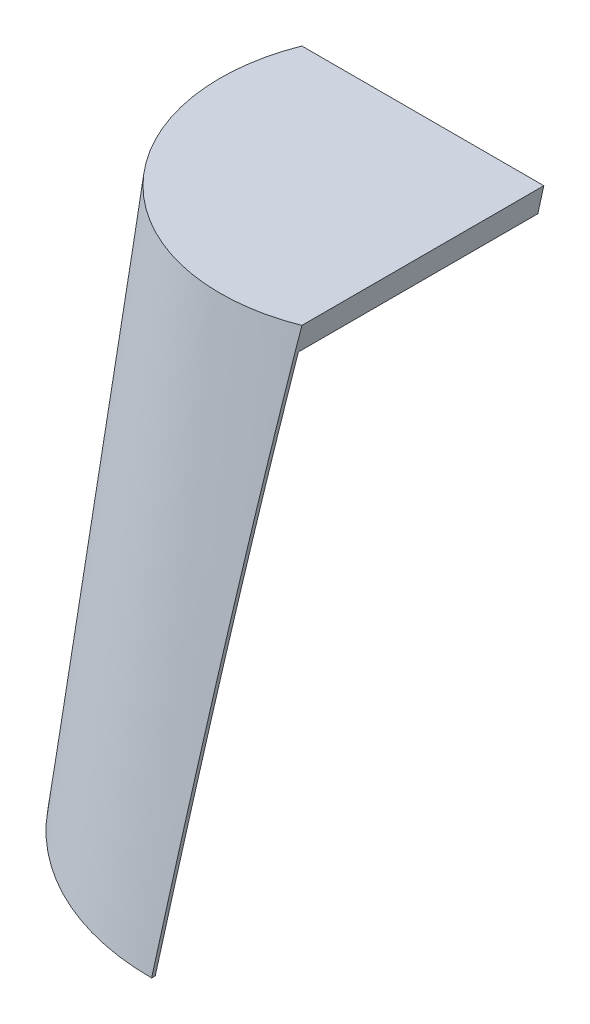
ISO-10303-21;
HEADER;
FILE_DESCRIPTION(('STEP AP214'),'2;1');
FILE_NAME('part.step','',(''),(''),'','','');
FILE_SCHEMA(('AUTOMOTIVE_DESIGN { 1 0 10303 214 1 1 1 1 }'));
ENDSEC;
DATA;
#1=APPLICATION_CONTEXT('core data for automotive mechanical design processes');
#2=APPLICATION_PROTOCOL_DEFINITION('international standard','automotive_design',2000,#1);
#3=PRODUCT_CONTEXT('',#1,'mechanical');
#4=PRODUCT('Part','Part','',(#3));
#5=PRODUCT_RELATED_PRODUCT_CATEGORY('part','',(#4));
#6=PRODUCT_DEFINITION_FORMATION('','',#4);
#7=PRODUCT_DEFINITION_CONTEXT('part definition',#1,'design');
#8=PRODUCT_DEFINITION('design','',#6,#7);
#9=PRODUCT_DEFINITION_SHAPE('','',#8);
#10=(LENGTH_UNIT() NAMED_UNIT(*) SI_UNIT(.MILLI.,.METRE.));
#11=(NAMED_UNIT(*) PLANE_ANGLE_UNIT() SI_UNIT($,.RADIAN.));
#12=(NAMED_UNIT(*) SI_UNIT($,.STERADIAN.) SOLID_ANGLE_UNIT());
#13=UNCERTAINTY_MEASURE_WITH_UNIT(LENGTH_MEASURE(1.E-05),#10,'distance_accuracy_value','');
#14=(GEOMETRIC_REPRESENTATION_CONTEXT(3) GLOBAL_UNCERTAINTY_ASSIGNED_CONTEXT((#13)) GLOBAL_UNIT_ASSIGNED_CONTEXT((#10,
#11,#12)) REPRESENTATION_CONTEXT('',''));
#15=CARTESIAN_POINT('',(0.,0.,0.));
#16=DIRECTION('',(0.,0.,1.));
#17=DIRECTION('',(1.,0.,0.));
#18=AXIS2_PLACEMENT_3D('',#15,#16,#17);
#19=CARTESIAN_POINT('',(0.,0.,0.));
#20=DIRECTION('',(0.,-1.,0.));
#21=DIRECTION('',(0.,0.,1.));
#22=AXIS2_PLACEMENT_3D('',#19,#20,#21);
#23=CONICAL_SURFACE('',#22,105.,0.122173047639604);
#24=CARTESIAN_POINT('',(0.,0.,0.));
#25=DIRECTION('',(0.,1.,0.));
#26=DIRECTION('',(0.,0.,1.));
#27=AXIS2_PLACEMENT_3D('',#24,#25,#26);
#28=CIRCLE('',#27,105.);
#29=CARTESIAN_POINT('',(-105.,0.,0.));
#30=VERTEX_POINT('',#29);
#31=CARTESIAN_POINT('',(0.,0.,105.));
#32=VERTEX_POINT('',#31);
#33=EDGE_CURVE('E97',#30,#32,#28,.T.);
#34=ORIENTED_EDGE('',*,*,#33,.T.);
#35=CARTESIAN_POINT('',(1.15461044806341E-11,9.40354747838742E-11,104.999999999988));
#36=CARTESIAN_POINT('',(0.471125000033078,3.83700521114893,104.528872754124));
#37=CARTESIAN_POINT('',(0.942203607260946,7.67363258322047,104.054625900163));
#38=CARTESIAN_POINT('',(1.88426302433211,15.3460908315838,103.099625841699));
#39=CARTESIAN_POINT('',(2.35524383414005,19.1819217075877,102.618872634849));
#40=CARTESIAN_POINT('',(3.76803474871054,30.6881803461448,101.166449997436));
#41=CARTESIAN_POINT('',(4.70969012834794,38.3573479736777,100.184620756593));
#42=CARTESIAN_POINT('',(6.5927773482113,53.6938626463365,98.1911934444353));
#43=CARTESIAN_POINT('',(7.53420907003656,61.3612087271661,97.1795878389695));
#44=CARTESIAN_POINT('',(9.41654748003539,76.6916248328794,95.1240321190811));
#45=CARTESIAN_POINT('',(10.3574541687711,84.3546948623418,94.0800820393602));
#46=CARTESIAN_POINT('',(12.2413472107948,99.697772429833,91.9535262965916));
#47=CARTESIAN_POINT('',(13.184331863626,107.377766118754,90.8708190943796));
#48=CARTESIAN_POINT('',(15.0696124909219,122.732144661401,88.6656489868726));
#49=CARTESIAN_POINT('',(16.0119084646978,130.406529509518,87.5431860418664));
#50=CARTESIAN_POINT('',(17.8955091952685,145.747226391271,85.2540494187358));
#51=CARTESIAN_POINT('',(18.8368141136414,153.413539740857,84.0873847024865));
#52=CARTESIAN_POINT('',(20.7184825581375,168.738499415421,81.7039763446331));
#53=CARTESIAN_POINT('',(21.6588460864137,176.397145757935,80.4872328178235));
#54=CARTESIAN_POINT('',(23.0685282218338,187.878085422123,78.6193103241918));
#55=CARTESIAN_POINT('',(23.5382690992144,191.703817858892,77.9895478742432));
#56=CARTESIAN_POINT('',(24.4774415606508,199.352763740443,76.714690990942));
#57=CARTESIAN_POINT('',(24.9468731450637,203.175977188135,76.0695965753227));
#58=CARTESIAN_POINT('',(25.8854006494354,210.819670315921,74.7629098890096));
#59=CARTESIAN_POINT('',(26.3544965656465,214.640149965492,74.1013174369796));
#60=CARTESIAN_POINT('',(27.2923104332812,222.278030988468,72.7603217355781));
#61=CARTESIAN_POINT('',(27.7610283847041,226.095432361866,72.0809184861733));
#62=CARTESIAN_POINT('',(28.6983242073424,233.729094246926,70.7023855502256));
#63=CARTESIAN_POINT('',(29.1669018252673,237.545352695701,70.0032442588444));
#64=CARTESIAN_POINT('',(30.1035835498612,245.174013153547,68.5838985158252));
#65=CARTESIAN_POINT('',(30.571687656442,248.986415161899,67.8636940602643));
#66=CARTESIAN_POINT('',(31.5073474644509,256.606752777055,66.4002446918153));
#67=CARTESIAN_POINT('',(31.974903181031,260.414688507263,65.6570004318623));
#68=CARTESIAN_POINT('',(32.9094050459126,268.025595432448,64.1451202930536));
#69=CARTESIAN_POINT('',(33.3763511944096,271.828566629015,63.3764844223392));
#70=CARTESIAN_POINT('',(34.3099865366579,279.432416293686,61.8103285980774));
#71=CARTESIAN_POINT('',(34.7766750650773,283.233289343095,61.0127819029947));
#72=CARTESIAN_POINT('',(35.7092387529003,290.828411082875,59.3862056195524));
#73=CARTESIAN_POINT('',(36.1751139106797,294.622659760018,58.5571759684001));
#74=CARTESIAN_POINT('',(37.1059704715042,302.203878066126,56.863552497302));
#75=CARTESIAN_POINT('',(37.5709517466057,305.990846653074,55.9989539330572));
#76=CARTESIAN_POINT('',(38.4997723493895,313.555483411585,54.229426621674));
#77=CARTESIAN_POINT('',(38.9636116832072,317.333151633117,53.3244980917197));
#78=CARTESIAN_POINT('',(39.8893875227782,324.872990785233,51.4693010216971));
#79=CARTESIAN_POINT('',(40.3513255948429,328.635174472398,50.519085339282));
#80=CARTESIAN_POINT('',(41.042961765914,334.268099051719,49.0531969012066));
#81=CARTESIAN_POINT('',(41.2732993139714,336.144047838469,48.5577976664296));
#82=CARTESIAN_POINT('',(41.7334961493413,339.892050290779,47.552274154419));
#83=CARTESIAN_POINT('',(41.9633554389336,341.764103974907,47.0421499475527));
#84=CARTESIAN_POINT('',(42.4224804679351,345.503377264849,46.0059500821693));
#85=CARTESIAN_POINT('',(42.6517463366351,347.370597923653,45.4798782840243));
#86=CARTESIAN_POINT('',(43.1096649683584,351.100045896231,44.4100947491623));
#87=CARTESIAN_POINT('',(43.3383177359598,352.962273247292,43.8663831445635));
#88=CARTESIAN_POINT('',(43.7949103037419,356.680921295748,42.7595034213145));
#89=CARTESIAN_POINT('',(44.0228501410161,358.537342295245,42.1963363339262));
#90=CARTESIAN_POINT('',(44.4779168536272,362.24356325059,41.0483503569279));
#91=CARTESIAN_POINT('',(44.7050437415784,364.093363309172,40.4635318048871));
#92=CARTESIAN_POINT('',(45.0456066426687,366.867025556168,39.566557817538));
#93=CARTESIAN_POINT('',(45.1593980475565,367.793782178099,39.2634725527415));
#94=CARTESIAN_POINT('',(45.3867193305968,369.645165457631,38.6507796812491));
#95=CARTESIAN_POINT('',(45.5002492095195,370.569792121504,38.341172093788));
#96=CARTESIAN_POINT('',(45.8404166547409,373.340233638906,37.4019382685595));
#97=CARTESIAN_POINT('',(46.0666296922353,375.182590982785,36.761907104736));
#98=CARTESIAN_POINT('',(46.5178726795777,378.857670194896,35.4496501717319));
#99=CARTESIAN_POINT('',(46.7429015301331,380.690383110108,34.7773988943005));
#100=CARTESIAN_POINT('',(47.1912789017459,384.342123754987,33.3962339779152));
#101=CARTESIAN_POINT('',(47.4146274704473,386.161151872683,32.6873213830067));
#102=CARTESIAN_POINT('',(47.8583596864298,389.775060760898,31.2293853259376));
#103=CARTESIAN_POINT('',(48.0787515699439,391.570008610151,30.4805317282453));
#104=CARTESIAN_POINT('',(48.4073514060585,394.246239511643,29.3190309737779));
#105=CARTESIAN_POINT('',(48.5165628112585,395.135695029478,28.9254579274413));
#106=CARTESIAN_POINT('',(48.7342173980501,396.908349385947,28.1242774977931));
#107=CARTESIAN_POINT('',(48.8426605956392,397.79154835487,27.7166704077746));
#108=CARTESIAN_POINT('',(49.058529750179,399.549661532555,26.8864435606377));
#109=CARTESIAN_POINT('',(49.1659567883203,400.42458454691,26.4638427589305));
#110=CARTESIAN_POINT('',(49.3797769028894,402.166009633229,25.6014225309381));
#111=CARTESIAN_POINT('',(49.4861700161921,403.032512005518,25.1616037215697));
#112=CARTESIAN_POINT('',(49.6977115689654,404.755379695215,24.2627802830661));
#113=CARTESIAN_POINT('',(49.8028603358424,405.611747679136,23.8037808514532));
#114=CARTESIAN_POINT('',(50.0116997681921,407.312608364013,22.8640319998713));
#115=CARTESIAN_POINT('',(50.1153905507426,408.157102018493,22.3832843395393));
#116=CARTESIAN_POINT('',(50.2757838802057,409.463400858376,21.613920211156));
#117=CARTESIAN_POINT('',(50.3330931591022,409.930147479247,21.3338051434176));
#118=CARTESIAN_POINT('',(50.44708890396,410.858568316683,20.7651679264326));
#119=CARTESIAN_POINT('',(50.50377537689,411.320242590005,20.4766458713871));
#120=CARTESIAN_POINT('',(50.6164595608839,412.237981621405,19.8904363386908));
#121=CARTESIAN_POINT('',(50.6724571166855,412.694045114973,19.5927468460638));
#122=CARTESIAN_POINT('',(50.7836516107536,413.599651595548,18.9874855855486));
#123=CARTESIAN_POINT('',(50.8388485376923,414.049194490295,18.6799136780345));
#124=CARTESIAN_POINT('',(51.0030284823463,415.386332836084,17.741378590531));
#125=CARTESIAN_POINT('',(51.1106654095794,416.262965259913,17.0942623810476));
#126=CARTESIAN_POINT('',(51.2684513244702,417.548028412238,16.0853276996181));
#127=CARTESIAN_POINT('',(51.3204291515656,417.971353842677,15.7426819667005));
#128=CARTESIAN_POINT('',(51.4229566279159,418.80637312846,15.0433209015468));
#129=CARTESIAN_POINT('',(51.4735064036105,419.218068013573,14.6866068216655));
#130=CARTESIAN_POINT('',(51.5822565572225,420.103766938684,13.8893315497246));
#131=CARTESIAN_POINT('',(51.6401132043025,420.574971515664,13.4455945156093));
#132=CARTESIAN_POINT('',(51.752902803511,421.493569085091,12.5338834770621));
#133=CARTESIAN_POINT('',(51.8078364612304,421.940967824114,12.0659153761668));
#134=CARTESIAN_POINT('',(51.914053833765,422.806038902705,11.1031604863247));
#135=CARTESIAN_POINT('',(51.965339851618,423.223729999011,10.6083909731788));
#136=CARTESIAN_POINT('',(52.0633351167157,424.021837386268,9.58954241613567));
#137=CARTESIAN_POINT('',(52.1100461384813,424.402268129531,9.06547486106767));
#138=CARTESIAN_POINT('',(52.2146873736963,425.254502599774,7.77658109638201));
#139=CARTESIAN_POINT('',(52.2699982068947,425.704973186561,6.99684163836502));
#140=CARTESIAN_POINT('',(52.3415349935015,426.287593559031,5.78283769530854));
#141=CARTESIAN_POINT('',(52.3634679404635,426.466223077276,5.37097752711695));
#142=CARTESIAN_POINT('',(52.4029731416146,426.787967121157,4.53330163046834));
#143=CARTESIAN_POINT('',(52.4205463726461,426.931089602537,4.10748905245223));
#144=CARTESIAN_POINT('',(52.4481363467318,427.155791909429,3.31941310961508));
#145=CARTESIAN_POINT('',(52.4589359912576,427.243747955746,2.95899112402412));
#146=CARTESIAN_POINT('',(52.4769029127993,427.390076789026,2.23212246933099));
#147=CARTESIAN_POINT('',(52.4840709681279,427.448455914838,1.86567710853892));
#148=CARTESIAN_POINT('',(52.4945722147373,427.53398170515,1.12929588888475));
#149=CARTESIAN_POINT('',(52.4979076046736,427.561146276264,0.759362154104457));
#150=CARTESIAN_POINT('',(52.5006517543134,427.583495581581,0.0184998035354696));
#151=CARTESIAN_POINT('',(52.5000604406047,427.578679717889,-0.352428830723921));
#152=CARTESIAN_POINT('',(52.494970314177,427.5372239649,-1.09224518881431));
#153=CARTESIAN_POINT('',(52.4904737843428,427.500602668206,-1.46113397831901));
#154=CARTESIAN_POINT('',(52.4777087805296,427.396640054997,-2.19445390246732));
#155=CARTESIAN_POINT('',(52.4694403356686,427.329298975629,-2.55888507149994));
#156=CARTESIAN_POINT('',(52.4493493932929,427.165671380856,-3.28134728269002));
#157=CARTESIAN_POINT('',(52.4375241502575,427.069362504981,-3.63937315354052));
#158=CARTESIAN_POINT('',(52.4106068308655,426.85013853094,-4.34717729321776));
#159=CARTESIAN_POINT('',(52.3955131283275,426.72721018859,-4.69695136004919));
#160=CARTESIAN_POINT('',(52.3549527904872,426.396872745983,-5.54161095992588));
#161=CARTESIAN_POINT('',(52.3278687822153,426.176291199958,-6.03128751959173));
#162=CARTESIAN_POINT('',(52.2684951266055,425.692731579977,-6.98897202960044));
#163=CARTESIAN_POINT('',(52.2362023127326,425.429727716662,-7.45696657483249));
#164=CARTESIAN_POINT('',(52.1672502948692,424.868158596275,-8.37180171432592));
#165=CARTESIAN_POINT('',(52.1305831642154,424.56952878171,-8.81860179098627));
#166=CARTESIAN_POINT('',(52.0536981770116,423.943350810812,-9.69090486649224));
#167=CARTESIAN_POINT('',(52.0134807278987,423.615805972787,-10.1164103003666));
#168=CARTESIAN_POINT('',(51.9321440128644,422.953371588234,-10.9273065727216));
#169=CARTESIAN_POINT('',(51.8911637426726,422.619614071081,-11.3136419077914));
#170=CARTESIAN_POINT('',(51.8069784222135,421.933979657111,-12.0696917032292));
#171=CARTESIAN_POINT('',(51.7637729739941,421.582099519237,-12.4394031682756));
#172=CARTESIAN_POINT('',(51.6754637072091,420.862878257739,-13.1637332402284));
#173=CARTESIAN_POINT('',(51.6303584799596,420.495525661306,-13.5183402409192));
#174=CARTESIAN_POINT('',(51.5385625057878,419.747907446958,-14.2134679582318));
#175=CARTESIAN_POINT('',(51.4918716462012,419.367640911465,-14.5539876700759));
#176=CARTESIAN_POINT('',(51.396999703315,418.594970942305,-15.223084619153));
#177=CARTESIAN_POINT('',(51.3488146329664,418.202535036729,-15.5516236946794));
#178=CARTESIAN_POINT('',(51.2512771391172,417.408155897105,-16.1967850172123));
#179=CARTESIAN_POINT('',(51.201924725145,417.006212740658,-16.5134073614326));
#180=CARTESIAN_POINT('',(51.1022340514603,416.194297358532,-17.1355645968099));
#181=CARTESIAN_POINT('',(51.0518963068407,415.784329327948,-17.4411050547599));
#182=CARTESIAN_POINT('',(50.9503397692041,414.95721770341,-18.0421423742674));
#183=CARTESIAN_POINT('',(50.8991209707607,414.540074065262,-18.3376391739325));
#184=CARTESIAN_POINT('',(50.7544301639348,413.361662009528,-19.1532064513662));
#185=CARTESIAN_POINT('',(50.6600858880937,412.593289543582,-19.6628786487706));
#186=CARTESIAN_POINT('',(50.4693751010649,411.040074826468,-20.656178688888));
#187=CARTESIAN_POINT('',(50.3730082915846,410.255230145901,-21.1398026518396));
#188=CARTESIAN_POINT('',(50.1785750263567,408.671698276764,-22.0844383072878));
#189=CARTESIAN_POINT('',(50.080507667453,407.873003732575,-22.5454374530176));
#190=CARTESIAN_POINT('',(49.8830104579014,406.264518039429,-23.4471966024981));
#191=CARTESIAN_POINT('',(49.7835806715014,405.454727413727,-23.8879575563828));
#192=CARTESIAN_POINT('',(49.5833448837185,403.823937790745,-24.7524707683262));
#193=CARTESIAN_POINT('',(49.4825362842896,403.002917634077,-25.1761824246726));
#194=CARTESIAN_POINT('',(49.2799341669054,401.352855803059,-26.0074322435305));
#195=CARTESIAN_POINT('',(49.178140638827,400.523814046263,-26.4149702395891));
#196=CARTESIAN_POINT('',(48.9737361900794,398.859073404243,-27.215354501846));
#197=CARTESIAN_POINT('',(48.8711255110529,398.023376487042,-27.6082049289829));
#198=CARTESIAN_POINT('',(48.6651673648349,396.345981994579,-28.3806956864561));
#199=CARTESIAN_POINT('',(48.5618198825211,395.504284296156,-28.7603357447147));
#200=CARTESIAN_POINT('',(48.2487694218949,392.95469289538,-29.8886088930825));
#201=CARTESIAN_POINT('',(48.0380749112881,391.238723810525,-30.6187601864461));
#202=CARTESIAN_POINT('',(47.6146378057662,387.790105332696,-32.0379286724225));
#203=CARTESIAN_POINT('',(47.4018950960827,386.057455005008,-32.7269435442432));
#204=CARTESIAN_POINT('',(46.9750830020254,382.581349451355,-34.0687838624647));
#205=CARTESIAN_POINT('',(46.761016031716,380.837913886369,-34.7216610908107));
#206=CARTESIAN_POINT('',(46.4389168442632,378.214626519584,-35.6781284288302));
#207=CARTESIAN_POINT('',(46.3313852121048,377.338851655321,-35.9931393651621));
#208=CARTESIAN_POINT('',(46.11601522801,375.584803894665,-36.6160323362366));
#209=CARTESIAN_POINT('',(46.0081768751222,374.706530990525,-36.9239143488398));
#210=CARTESIAN_POINT('',(45.678304577064,372.019936718147,-37.8543000180528));
#211=CARTESIAN_POINT('',(45.4558195060727,370.207941224941,-38.4660537390291));
#212=CARTESIAN_POINT('',(45.0098550710664,366.575852371693,-39.6647127849219));
#213=CARTESIAN_POINT('',(44.786375684879,364.755758831072,-40.2516175526271));
#214=CARTESIAN_POINT('',(44.338553029492,361.108535987306,-41.403326816723));
#215=CARTESIAN_POINT('',(44.1142096889868,359.281406103422,-41.9681294440503));
#216=CARTESIAN_POINT('',(43.6647962930135,355.621227717243,-43.0778433445697));
#217=CARTESIAN_POINT('',(43.4397262424751,353.788179255096,-43.6227547523848));
#218=CARTESIAN_POINT('',(42.9888727455981,350.116272188266,-44.6947883804697));
#219=CARTESIAN_POINT('',(42.7630890762373,348.277411767213,-45.2219042781766));
#220=CARTESIAN_POINT('',(42.3109641778069,344.595149965683,-46.2597749439659));
#221=CARTESIAN_POINT('',(42.0846229478805,342.751748578229,-46.7705296868914));
#222=CARTESIAN_POINT('',(41.6314569403947,339.061007623882,-47.7770585792389));
#223=CARTESIAN_POINT('',(41.4046321836173,337.213668226245,-48.2728333591349));
#224=CARTESIAN_POINT('',(40.9505425913029,333.515405277099,-49.2506335323443));
#225=CARTESIAN_POINT('',(40.7232777539179,331.664481710539,-49.7326588677876));
#226=CARTESIAN_POINT('',(40.0398470334123,326.098385163221,-51.1619255244764));
#227=CARTESIAN_POINT('',(39.5830863566276,322.378367976809,-52.0900554988338));
#228=CARTESIAN_POINT('',(38.6682778034267,314.927850204268,-53.9025246793529));
#229=CARTESIAN_POINT('',(38.2102299166023,311.197349533368,-54.786863530337));
#230=CARTESIAN_POINT('',(37.2931538210505,303.728364110379,-56.5171293461643));
#231=CARTESIAN_POINT('',(36.8341258215193,299.989881062058,-57.3630637879355));
#232=CARTESIAN_POINT('',(35.915168970069,292.505578111485,-59.0211971219547));
#233=CARTESIAN_POINT('',(35.4552401211002,288.759758233264,-59.8333961245014));
#234=CARTESIAN_POINT('',(34.5734303171007,281.577993705907,-61.3605103859844));
#235=CARTESIAN_POINT('',(34.1516116956231,278.142556722823,-62.0778534836674));
#236=CARTESIAN_POINT('',(33.3074078955614,271.267068519309,-63.489705112109));
#237=CARTESIAN_POINT('',(32.885022717116,267.827017300007,-64.1842136484523));
#238=CARTESIAN_POINT('',(32.0397280768845,260.942644916251,-65.5524606827293));
#239=CARTESIAN_POINT('',(31.6168185861113,257.498323515716,-66.2261979736839));
#240=CARTESIAN_POINT('',(30.770554957455,250.606059354545,-67.5546045044878));
#241=CARTESIAN_POINT('',(30.3472008190992,247.158116590059,-68.2092737240494));
#242=CARTESIAN_POINT('',(29.5019716089425,240.274277091499,-69.4981973462057));
#243=CARTESIAN_POINT('',(29.0800982930303,236.838394657992,-70.1325293377915));
#244=CARTESIAN_POINT('',(28.2359968621556,229.963740184599,-71.3851021956115));
#245=CARTESIAN_POINT('',(27.8137687468804,226.524968142166,-72.003343047648));
#246=CARTESIAN_POINT('',(26.9690346831688,219.645161287789,-73.2248310761873));
#247=CARTESIAN_POINT('',(26.5465287670392,216.204126738961,-73.8280797582237));
#248=CARTESIAN_POINT('',(25.7012265815021,209.319692903623,-75.0206446354708));
#249=CARTESIAN_POINT('',(25.2784303132134,205.876293626224,-75.6099608840609));
#250=CARTESIAN_POINT('',(24.8555022521086,202.431820982475,-76.1928115182607));
#251=B_SPLINE_CURVE_WITH_KNOTS('',3,(#35,#36,#37,#38,#39,#40,#41,#42,#43,#44,#45,#46,#47,#48,
#49,#50,#51,#52,#53,#54,#55,#56,#57,#58,#59,#60,#61,#62,#63,#64,#65,#66,#67,#68,#69,#70,#71,#72,
#73,#74,#75,#76,#77,#78,#79,#80,#81,#82,#83,#84,#85,#86,#87,#88,#89,#90,#91,#92,#93,#94,#95,#96,
#97,#98,#99,#100,#101,#102,#103,#104,#105,#106,#107,#108,#109,#110,#111,#112,#113,#114,#115,
#116,#117,#118,#119,#120,#121,#122,#123,#124,#125,#126,#127,#128,#129,#130,#131,#132,#133,#134,
#135,#136,#137,#138,#139,#140,#141,#142,#143,#144,#145,#146,#147,#148,#149,#150,#151,#152,#153,
#154,#155,#156,#157,#158,#159,#160,#161,#162,#163,#164,#165,#166,#167,#168,#169,#170,#171,#172,
#173,#174,#175,#176,#177,#178,#179,#180,#181,#182,#183,#184,#185,#186,#187,#188,#189,#190,#191,
#192,#193,#194,#195,#196,#197,#198,#199,#200,#201,#202,#203,#204,#205,#206,#207,#208,#209,#210,
#211,#212,#213,#214,#215,#216,#217,#218,#219,#220,#221,#222,#223,#224,#225,#226,#227,#228,#229,
#230,#231,#232,#233,#234,#235,#236,#237,#238,#239,#240,#241,#242,#243,#244,#245,#246,#247,#248,
#249,#250),.UNSPECIFIED.,.F.,.F.,(4,2,2,2,2,2,2,2,2,2,2,2,2,2,2,2,2,2,2,2,2,2,2,2,2,2,2,2,2,2,2,
2,2,2,2,2,2,2,2,2,2,2,2,2,2,2,2,2,2,2,2,2,2,2,2,2,2,2,2,2,2,2,2,2,2,2,2,2,2,2,2,2,2,2,2,2,2,2,2,
2,2,2,2,2,2,2,2,2,2,2,2,2,2,2,2,2,2,2,2,2,2,2,2,2,2,2,2,4),(0.,11.6832657804841,
23.3665357762062,46.733155376318,70.1057390079485,93.4782975644911,116.917360900452,
140.356447649939,163.790807310206,187.22511325541,198.941801460684,210.658476114815,
222.375279608086,234.092083123253,245.81592512285,257.53976930595,269.263281545116,
280.986790025483,292.721433851275,304.456101083061,316.192338630753,327.928512984289,
339.65130958542,345.512911042496,351.374484492897,357.234650210055,363.094772046014,
368.954583734129,374.814304100003,377.759309673958,380.704306564087,386.594360747589,
392.489157624801,398.383786721603,404.255084876635,407.191247232067,410.12734826278,
413.059861147169,415.992269056355,418.923887436523,421.85526904382,423.497269672219,
425.139251908915,426.781597661304,428.423966628142,431.706823986681,433.347866632538,
434.988763522152,436.937485002899,438.885733920541,440.832741632379,442.778991135158,
445.475727161547,446.822811204372,448.169593145036,449.281923035329,450.394014433037,
451.505467546879,452.616941440119,453.727766032482,454.838582049806,455.950257724968,
457.06248777658,458.673114878056,460.284724827392,461.899300835696,463.513691794425,
465.04956450332,466.585712848839,468.123021021981,469.660438655451,471.202388148138,
472.744325059236,474.285476363826,475.826637163795,478.606532332533,481.386840414953,
484.168673308581,486.950375468067,489.738351218528,492.526355654279,495.31356417871,
498.100830073887,503.730262613001,509.360012448071,514.981474622717,517.79214228121,
520.602818667319,526.378719988135,532.154750758838,537.931268927574,543.707747993762,
549.486258235639,555.264777362122,561.043052943663,566.821352841894,578.404500187669,
589.987741465742,601.568717853765,613.149656374543,623.753943306425,634.358227644816,
644.963127021877,655.568037681835,666.125969189959,676.683910013296,687.240786274604,
697.79762208271),.UNSPECIFIED.);
#252=CARTESIAN_POINT('',(28.2404490076681,230.,71.3758061838163));
#253=VERTEX_POINT('',#252);
#254=EDGE_CURVE('E94',#253,#32,#251,.F.);
#255=ORIENTED_EDGE('',*,*,#254,.F.);
#256=CARTESIAN_POINT('',(0.,230.,0.));
#257=DIRECTION('',(0.,1.,0.));
#258=DIRECTION('',(0.,0.,1.));
#259=AXIS2_PLACEMENT_3D('',#256,#257,#258);
#260=CIRCLE('',#259,76.7595509923318);
#261=CARTESIAN_POINT('',(-71.3758061838163,230.,-28.2404490076681));
#262=VERTEX_POINT('',#261);
#263=EDGE_CURVE('E92',#262,#253,#260,.T.);
#264=ORIENTED_EDGE('',*,*,#263,.F.);
#265=CARTESIAN_POINT('',(-104.999999999988,9.40354747838742E-11,-1.15461044806341E-11));
#266=CARTESIAN_POINT('',(-104.528872754124,3.83700521114893,-0.471125000033078));
#267=CARTESIAN_POINT('',(-104.054625900163,7.67363258322047,-0.942203607260946));
#268=CARTESIAN_POINT('',(-103.099625841699,15.3460908315838,-1.88426302433211));
#269=CARTESIAN_POINT('',(-102.618872634849,19.1819217075877,-2.35524383414005));
#270=CARTESIAN_POINT('',(-101.166449997436,30.6881803461448,-3.76803474871054));
#271=CARTESIAN_POINT('',(-100.184620756593,38.3573479736777,-4.70969012834794));
#272=CARTESIAN_POINT('',(-98.1911934444353,53.6938626463365,-6.5927773482113));
#273=CARTESIAN_POINT('',(-97.1795878389695,61.3612087271661,-7.53420907003656));
#274=CARTESIAN_POINT('',(-95.1240321190811,76.6916248328794,-9.41654748003539));
#275=CARTESIAN_POINT('',(-94.0800820393602,84.3546948623418,-10.3574541687711));
#276=CARTESIAN_POINT('',(-91.9535262965916,99.697772429833,-12.2413472107948));
#277=CARTESIAN_POINT('',(-90.8708190943796,107.377766118754,-13.184331863626));
#278=CARTESIAN_POINT('',(-88.6656489868726,122.732144661401,-15.0696124909219));
#279=CARTESIAN_POINT('',(-87.5431860418664,130.406529509518,-16.0119084646978));
#280=CARTESIAN_POINT('',(-85.2540494187358,145.747226391271,-17.8955091952685));
#281=CARTESIAN_POINT('',(-84.0873847024865,153.413539740857,-18.8368141136414));
#282=CARTESIAN_POINT('',(-81.7039763446331,168.738499415421,-20.7184825581375));
#283=CARTESIAN_POINT('',(-80.4872328178235,176.397145757935,-21.6588460864137));
#284=CARTESIAN_POINT('',(-78.6193103241918,187.878085422123,-23.0685282218338));
#285=CARTESIAN_POINT('',(-77.9895478742432,191.703817858892,-23.5382690992144));
#286=CARTESIAN_POINT('',(-76.714690990942,199.352763740443,-24.4774415606508));
#287=CARTESIAN_POINT('',(-76.0695965753227,203.175977188135,-24.9468731450637));
#288=CARTESIAN_POINT('',(-74.7629098890096,210.819670315921,-25.8854006494354));
#289=CARTESIAN_POINT('',(-74.1013174369796,214.640149965492,-26.3544965656465));
#290=CARTESIAN_POINT('',(-72.7603217355781,222.278030988468,-27.2923104332812));
#291=CARTESIAN_POINT('',(-72.0809184861733,226.095432361866,-27.7610283847041));
#292=CARTESIAN_POINT('',(-70.7023855502256,233.729094246926,-28.6983242073424));
#293=CARTESIAN_POINT('',(-70.0032442588444,237.545352695701,-29.1669018252673));
#294=CARTESIAN_POINT('',(-68.5838985158252,245.174013153547,-30.1035835498612));
#295=CARTESIAN_POINT('',(-67.8636940602643,248.986415161899,-30.571687656442));
#296=CARTESIAN_POINT('',(-66.4002446918153,256.606752777055,-31.5073474644509));
#297=CARTESIAN_POINT('',(-65.6570004318623,260.414688507263,-31.974903181031));
#298=CARTESIAN_POINT('',(-64.1451202930536,268.025595432448,-32.9094050459126));
#299=CARTESIAN_POINT('',(-63.3764844223392,271.828566629015,-33.3763511944096));
#300=CARTESIAN_POINT('',(-61.8103285980774,279.432416293686,-34.3099865366579));
#301=CARTESIAN_POINT('',(-61.0127819029947,283.233289343095,-34.7766750650773));
#302=CARTESIAN_POINT('',(-59.3862056195524,290.828411082875,-35.7092387529003));
#303=CARTESIAN_POINT('',(-58.5571759684001,294.622659760018,-36.1751139106797));
#304=CARTESIAN_POINT('',(-56.863552497302,302.203878066126,-37.1059704715042));
#305=CARTESIAN_POINT('',(-55.9989539330572,305.990846653074,-37.5709517466057));
#306=CARTESIAN_POINT('',(-54.229426621674,313.555483411585,-38.4997723493895));
#307=CARTESIAN_POINT('',(-53.3244980917197,317.333151633117,-38.9636116832072));
#308=CARTESIAN_POINT('',(-51.4693010216971,324.872990785233,-39.8893875227782));
#309=CARTESIAN_POINT('',(-50.519085339282,328.635174472398,-40.3513255948429));
#310=CARTESIAN_POINT('',(-49.0531969012066,334.268099051719,-41.042961765914));
#311=CARTESIAN_POINT('',(-48.5577976664296,336.144047838469,-41.2732993139714));
#312=CARTESIAN_POINT('',(-47.552274154419,339.892050290779,-41.7334961493413));
#313=CARTESIAN_POINT('',(-47.0421499475527,341.764103974907,-41.9633554389336));
#314=CARTESIAN_POINT('',(-46.0059500821693,345.503377264849,-42.4224804679351));
#315=CARTESIAN_POINT('',(-45.4798782840243,347.370597923653,-42.6517463366351));
#316=CARTESIAN_POINT('',(-44.4100947491623,351.100045896231,-43.1096649683584));
#317=CARTESIAN_POINT('',(-43.8663831445635,352.962273247292,-43.3383177359598));
#318=CARTESIAN_POINT('',(-42.7595034213145,356.680921295748,-43.7949103037419));
#319=CARTESIAN_POINT('',(-42.1963363339262,358.537342295245,-44.0228501410161));
#320=CARTESIAN_POINT('',(-41.0483503569279,362.24356325059,-44.4779168536272));
#321=CARTESIAN_POINT('',(-40.4635318048871,364.093363309172,-44.7050437415784));
#322=CARTESIAN_POINT('',(-39.566557817538,366.867025556168,-45.0456066426687));
#323=CARTESIAN_POINT('',(-39.2634725527415,367.793782178099,-45.1593980475565));
#324=CARTESIAN_POINT('',(-38.6507796812491,369.645165457631,-45.3867193305968));
#325=CARTESIAN_POINT('',(-38.341172093788,370.569792121504,-45.5002492095195));
#326=CARTESIAN_POINT('',(-37.4019382685595,373.340233638906,-45.8404166547409));
#327=CARTESIAN_POINT('',(-36.761907104736,375.182590982785,-46.0666296922353));
#328=CARTESIAN_POINT('',(-35.4496501717319,378.857670194896,-46.5178726795777));
#329=CARTESIAN_POINT('',(-34.7773988943005,380.690383110108,-46.7429015301331));
#330=CARTESIAN_POINT('',(-33.3962339779152,384.342123754987,-47.1912789017459));
#331=CARTESIAN_POINT('',(-32.6873213830067,386.161151872683,-47.4146274704473));
#332=CARTESIAN_POINT('',(-31.2293853259376,389.775060760898,-47.8583596864298));
#333=CARTESIAN_POINT('',(-30.4805317282453,391.570008610151,-48.0787515699439));
#334=CARTESIAN_POINT('',(-29.3190309737779,394.246239511643,-48.4073514060585));
#335=CARTESIAN_POINT('',(-28.9254579274413,395.135695029478,-48.5165628112585));
#336=CARTESIAN_POINT('',(-28.1242774977931,396.908349385947,-48.7342173980501));
#337=CARTESIAN_POINT('',(-27.7166704077746,397.79154835487,-48.8426605956392));
#338=CARTESIAN_POINT('',(-26.8864435606377,399.549661532555,-49.058529750179));
#339=CARTESIAN_POINT('',(-26.4638427589305,400.42458454691,-49.1659567883203));
#340=CARTESIAN_POINT('',(-25.6014225309381,402.166009633229,-49.3797769028894));
#341=CARTESIAN_POINT('',(-25.1616037215697,403.032512005518,-49.4861700161921));
#342=CARTESIAN_POINT('',(-24.2627802830661,404.755379695215,-49.6977115689654));
#343=CARTESIAN_POINT('',(-23.8037808514532,405.611747679136,-49.8028603358424));
#344=CARTESIAN_POINT('',(-22.8640319998713,407.312608364013,-50.0116997681921));
#345=CARTESIAN_POINT('',(-22.3832843395393,408.157102018493,-50.1153905507426));
#346=CARTESIAN_POINT('',(-21.6139202111559,409.463400858376,-50.2757838802057));
#347=CARTESIAN_POINT('',(-21.3338051434176,409.930147479247,-50.3330931591022));
#348=CARTESIAN_POINT('',(-20.7651679264326,410.858568316683,-50.44708890396));
#349=CARTESIAN_POINT('',(-20.4766458713871,411.320242590005,-50.50377537689));
#350=CARTESIAN_POINT('',(-19.8904363386908,412.237981621405,-50.6164595608839));
#351=CARTESIAN_POINT('',(-19.5927468460638,412.694045114973,-50.6724571166855));
#352=CARTESIAN_POINT('',(-18.9874855855486,413.599651595548,-50.7836516107536));
#353=CARTESIAN_POINT('',(-18.6799136780345,414.049194490295,-50.8388485376923));
#354=CARTESIAN_POINT('',(-17.741378590531,415.386332836084,-51.0030284823463));
#355=CARTESIAN_POINT('',(-17.0942623810476,416.262965259913,-51.1106654095794));
#356=CARTESIAN_POINT('',(-16.0853276996181,417.548028412238,-51.2684513244702));
#357=CARTESIAN_POINT('',(-15.7426819667006,417.971353842676,-51.3204291515656));
#358=CARTESIAN_POINT('',(-15.0433209015468,418.806373128459,-51.4229566279159));
#359=CARTESIAN_POINT('',(-14.6866068216655,419.218068013573,-51.4735064036105));
#360=CARTESIAN_POINT('',(-13.8893315497246,420.103766938684,-51.5822565572225));
#361=CARTESIAN_POINT('',(-13.4455945156093,420.574971515664,-51.6401132043025));
#362=CARTESIAN_POINT('',(-12.5338834770621,421.493569085091,-51.752902803511));
#363=CARTESIAN_POINT('',(-12.0659153761668,421.940967824114,-51.8078364612304));
#364=CARTESIAN_POINT('',(-11.1031604863247,422.806038902705,-51.914053833765));
#365=CARTESIAN_POINT('',(-10.6083909731788,423.223729999011,-51.965339851618));
#366=CARTESIAN_POINT('',(-9.58954241613567,424.021837386268,-52.0633351167157));
#367=CARTESIAN_POINT('',(-9.06547486106767,424.402268129531,-52.1100461384813));
#368=CARTESIAN_POINT('',(-7.77658109638201,425.254502599774,-52.2146873736963));
#369=CARTESIAN_POINT('',(-6.99684163836502,425.704973186561,-52.2699982068947));
#370=CARTESIAN_POINT('',(-5.78283769530854,426.287593559031,-52.3415349935015));
#371=CARTESIAN_POINT('',(-5.37097752711695,426.466223077276,-52.3634679404635));
#372=CARTESIAN_POINT('',(-4.53330163046834,426.787967121157,-52.4029731416146));
#373=CARTESIAN_POINT('',(-4.10748905245223,426.931089602537,-52.4205463726461));
#374=CARTESIAN_POINT('',(-3.31941310961508,427.155791909429,-52.4481363467318));
#375=CARTESIAN_POINT('',(-2.95899112402412,427.243747955746,-52.4589359912576));
#376=CARTESIAN_POINT('',(-2.23212246933099,427.390076789026,-52.4769029127993));
#377=CARTESIAN_POINT('',(-1.86567710853892,427.448455914838,-52.4840709681279));
#378=CARTESIAN_POINT('',(-1.12929588888475,427.53398170515,-52.4945722147373));
#379=CARTESIAN_POINT('',(-0.759362154104457,427.561146276264,-52.4979076046736));
#380=CARTESIAN_POINT('',(-0.0184998035354703,427.583495581581,-52.5006517543134));
#381=CARTESIAN_POINT('',(0.352428830723921,427.578679717889,-52.5000604406047));
#382=CARTESIAN_POINT('',(1.09224518881431,427.5372239649,-52.494970314177));
#383=CARTESIAN_POINT('',(1.46113397831901,427.500602668206,-52.4904737843428));
#384=CARTESIAN_POINT('',(2.19445390246732,427.396640054997,-52.4777087805296));
#385=CARTESIAN_POINT('',(2.55888507149994,427.329298975629,-52.4694403356686));
#386=CARTESIAN_POINT('',(3.28134728269002,427.165671380856,-52.4493493932929));
#387=CARTESIAN_POINT('',(3.63937315354052,427.069362504981,-52.4375241502575));
#388=CARTESIAN_POINT('',(4.34717729321776,426.85013853094,-52.4106068308655));
#389=CARTESIAN_POINT('',(4.6969513600492,426.72721018859,-52.3955131283275));
#390=CARTESIAN_POINT('',(5.54161095992585,426.396872745983,-52.3549527904872));
#391=CARTESIAN_POINT('',(6.03128751959167,426.176291199958,-52.3278687822153));
#392=CARTESIAN_POINT('',(6.98897202960039,425.692731579977,-52.2684951266055));
#393=CARTESIAN_POINT('',(7.45696657483247,425.429727716662,-52.2362023127326));
#394=CARTESIAN_POINT('',(8.37180171432593,424.868158596275,-52.1672502948692));
#395=CARTESIAN_POINT('',(8.81860179098628,424.56952878171,-52.1305831642154));
#396=CARTESIAN_POINT('',(9.69090486649223,423.943350810812,-52.0536981770116));
#397=CARTESIAN_POINT('',(10.1164103003666,423.615805972787,-52.0134807278987));
#398=CARTESIAN_POINT('',(10.9273065727216,422.953371588234,-51.9321440128644));
#399=CARTESIAN_POINT('',(11.3136419077914,422.619614071081,-51.8911637426726));
#400=CARTESIAN_POINT('',(12.0696917032293,421.933979657111,-51.8069784222135));
#401=CARTESIAN_POINT('',(12.4394031682757,421.582099519237,-51.7637729739941));
#402=CARTESIAN_POINT('',(13.1637332402285,420.862878257739,-51.6754637072091));
#403=CARTESIAN_POINT('',(13.5183402409192,420.495525661306,-51.6303584799596));
#404=CARTESIAN_POINT('',(14.2134679582318,419.747907446958,-51.5385625057878));
#405=CARTESIAN_POINT('',(14.5539876700759,419.367640911465,-51.4918716462012));
#406=CARTESIAN_POINT('',(15.223084619153,418.594970942305,-51.396999703315));
#407=CARTESIAN_POINT('',(15.5516236946794,418.202535036729,-51.3488146329664));
#408=CARTESIAN_POINT('',(16.1967850172123,417.408155897105,-51.2512771391172));
#409=CARTESIAN_POINT('',(16.5134073614326,417.006212740658,-51.201924725145));
#410=CARTESIAN_POINT('',(17.1355645968099,416.194297358532,-51.1022340514603));
#411=CARTESIAN_POINT('',(17.4411050547599,415.784329327948,-51.0518963068407));
#412=CARTESIAN_POINT('',(18.0421423742674,414.95721770341,-50.9503397692041));
#413=CARTESIAN_POINT('',(18.3376391739325,414.540074065262,-50.8991209707607));
#414=CARTESIAN_POINT('',(19.1532064513662,413.361662009528,-50.7544301639348));
#415=CARTESIAN_POINT('',(19.6628786487706,412.593289543582,-50.6600858880937));
#416=CARTESIAN_POINT('',(20.656178688888,411.040074826467,-50.4693751010649));
#417=CARTESIAN_POINT('',(21.1398026518397,410.255230145901,-50.3730082915846));
#418=CARTESIAN_POINT('',(22.0844383072879,408.671698276764,-50.1785750263567));
#419=CARTESIAN_POINT('',(22.5454374530177,407.873003732575,-50.080507667453));
#420=CARTESIAN_POINT('',(23.4471966024981,406.264518039429,-49.8830104579014));
#421=CARTESIAN_POINT('',(23.8879575563829,405.454727413727,-49.7835806715014));
#422=CARTESIAN_POINT('',(24.7524707683262,403.823937790745,-49.5833448837185));
#423=CARTESIAN_POINT('',(25.1761824246726,403.002917634077,-49.4825362842896));
#424=CARTESIAN_POINT('',(26.0074322435306,401.352855803059,-49.2799341669053));
#425=CARTESIAN_POINT('',(26.4149702395892,400.523814046263,-49.178140638827));
#426=CARTESIAN_POINT('',(27.2153545018461,398.859073404243,-48.9737361900794));
#427=CARTESIAN_POINT('',(27.608204928983,398.023376487042,-48.8711255110529));
#428=CARTESIAN_POINT('',(28.3806956864562,396.345981994579,-48.6651673648349));
#429=CARTESIAN_POINT('',(28.7603357447148,395.504284296156,-48.561819882521));
#430=CARTESIAN_POINT('',(29.8886088930825,392.954692895379,-48.2487694218949));
#431=CARTESIAN_POINT('',(30.6187601864462,391.238723810525,-48.038074911288));
#432=CARTESIAN_POINT('',(32.0379286724226,387.790105332695,-47.6146378057661));
#433=CARTESIAN_POINT('',(32.7269435442433,386.057455005007,-47.4018950960827));
#434=CARTESIAN_POINT('',(34.0687838624648,382.581349451355,-46.9750830020253));
#435=CARTESIAN_POINT('',(34.7216610908108,380.837913886369,-46.761016031716));
#436=CARTESIAN_POINT('',(35.6781284288303,378.214626519584,-46.4389168442632));
#437=CARTESIAN_POINT('',(35.9931393651622,377.338851655321,-46.3313852121048));
#438=CARTESIAN_POINT('',(36.6160323362367,375.584803894665,-46.11601522801));
#439=CARTESIAN_POINT('',(36.9239143488398,374.706530990525,-46.0081768751222));
#440=CARTESIAN_POINT('',(37.8543000180528,372.019936718147,-45.678304577064));
#441=CARTESIAN_POINT('',(38.4660537390292,370.207941224941,-45.4558195060727));
#442=CARTESIAN_POINT('',(39.6647127849219,366.575852371693,-45.0098550710664));
#443=CARTESIAN_POINT('',(40.2516175526271,364.755758831072,-44.786375684879));
#444=CARTESIAN_POINT('',(41.403326816723,361.108535987305,-44.338553029492));
#445=CARTESIAN_POINT('',(41.9681294440504,359.281406103422,-44.1142096889868));
#446=CARTESIAN_POINT('',(43.0778433445698,355.621227717243,-43.6647962930135));
#447=CARTESIAN_POINT('',(43.6227547523849,353.788179255096,-43.4397262424751));
#448=CARTESIAN_POINT('',(44.6947883804697,350.116272188266,-42.9888727455981));
#449=CARTESIAN_POINT('',(45.2219042781766,348.277411767213,-42.7630890762373));
#450=CARTESIAN_POINT('',(46.2597749439659,344.595149965683,-42.3109641778069));
#451=CARTESIAN_POINT('',(46.7705296868914,342.751748578228,-42.0846229478805));
#452=CARTESIAN_POINT('',(47.777058579239,339.061007623882,-41.6314569403947));
#453=CARTESIAN_POINT('',(48.2728333591349,337.213668226245,-41.4046321836173));
#454=CARTESIAN_POINT('',(49.2506335323444,333.515405277099,-40.9505425913028));
#455=CARTESIAN_POINT('',(49.7326588677876,331.664481710538,-40.7232777539179));
#456=CARTESIAN_POINT('',(51.1619255244765,326.098385163221,-40.0398470334123));
#457=CARTESIAN_POINT('',(52.0900554988338,322.378367976809,-39.5830863566275));
#458=CARTESIAN_POINT('',(53.902524679353,314.927850204268,-38.6682778034267));
#459=CARTESIAN_POINT('',(54.7868635303371,311.197349533368,-38.2102299166023));
#460=CARTESIAN_POINT('',(56.5171293461643,303.728364110379,-37.2931538210504));
#461=CARTESIAN_POINT('',(57.3630637879356,299.989881062057,-36.8341258215193));
#462=CARTESIAN_POINT('',(59.0211971219547,292.505578111485,-35.9151689700689));
#463=CARTESIAN_POINT('',(59.8333961245015,288.759758233264,-35.4552401211002));
#464=CARTESIAN_POINT('',(61.3605103859845,281.577993705907,-34.5734303171006));
#465=CARTESIAN_POINT('',(62.0778534836675,278.142556722823,-34.151611695623));
#466=CARTESIAN_POINT('',(63.4897051121091,271.267068519308,-33.3074078955614));
#467=CARTESIAN_POINT('',(64.1842136484524,267.827017300006,-32.8850227171159));
#468=CARTESIAN_POINT('',(65.5524606827294,260.942644916251,-32.0397280768844));
#469=CARTESIAN_POINT('',(66.2261979736839,257.498323515716,-31.6168185861113));
#470=CARTESIAN_POINT('',(67.5546045044879,250.606059354544,-30.770554957455));
#471=CARTESIAN_POINT('',(68.2092737240494,247.158116590058,-30.3472008190992));
#472=CARTESIAN_POINT('',(69.4981973462057,240.274277091499,-29.5019716089425));
#473=CARTESIAN_POINT('',(70.1325293377916,236.838394657991,-29.0800982930303));
#474=CARTESIAN_POINT('',(71.3851021956116,229.963740184598,-28.2359968621556));
#475=CARTESIAN_POINT('',(72.0033430476481,226.524968142166,-27.8137687468803));
#476=CARTESIAN_POINT('',(73.2248310761874,219.645161287788,-26.9690346831687));
#477=CARTESIAN_POINT('',(73.8280797582238,216.20412673896,-26.5465287670392));
#478=CARTESIAN_POINT('',(75.0206446354709,209.319692903622,-25.7012265815021));
#479=CARTESIAN_POINT('',(75.609960884061,205.876293626224,-25.2784303132134));
#480=CARTESIAN_POINT('',(76.1928115182608,202.431820982475,-24.8555022521086));
#481=B_SPLINE_CURVE_WITH_KNOTS('',3,(#265,#266,#267,#268,#269,#270,#271,#272,#273,#274,#275,
#276,#277,#278,#279,#280,#281,#282,#283,#284,#285,#286,#287,#288,#289,#290,#291,#292,#293,#294,
#295,#296,#297,#298,#299,#300,#301,#302,#303,#304,#305,#306,#307,#308,#309,#310,#311,#312,#313,
#314,#315,#316,#317,#318,#319,#320,#321,#322,#323,#324,#325,#326,#327,#328,#329,#330,#331,#332,
#333,#334,#335,#336,#337,#338,#339,#340,#341,#342,#343,#344,#345,#346,#347,#348,#349,#350,#351,
#352,#353,#354,#355,#356,#357,#358,#359,#360,#361,#362,#363,#364,#365,#366,#367,#368,#369,#370,
#371,#372,#373,#374,#375,#376,#377,#378,#379,#380,#381,#382,#383,#384,#385,#386,#387,#388,#389,
#390,#391,#392,#393,#394,#395,#396,#397,#398,#399,#400,#401,#402,#403,#404,#405,#406,#407,#408,
#409,#410,#411,#412,#413,#414,#415,#416,#417,#418,#419,#420,#421,#422,#423,#424,#425,#426,#427,
#428,#429,#430,#431,#432,#433,#434,#435,#436,#437,#438,#439,#440,#441,#442,#443,#444,#445,#446,
#447,#448,#449,#450,#451,#452,#453,#454,#455,#456,#457,#458,#459,#460,#461,#462,#463,#464,#465,
#466,#467,#468,#469,#470,#471,#472,#473,#474,#475,#476,#477,#478,#479,#480),.UNSPECIFIED.,.F.,
.F.,(4,2,2,2,2,2,2,2,2,2,2,2,2,2,2,2,2,2,2,2,2,2,2,2,2,2,2,2,2,2,2,2,2,2,2,2,2,2,2,2,2,2,2,2,2,
2,2,2,2,2,2,2,2,2,2,2,2,2,2,2,2,2,2,2,2,2,2,2,2,2,2,2,2,2,2,2,2,2,2,2,2,2,2,2,2,2,2,2,2,2,2,2,2,
2,2,2,2,2,2,2,2,2,2,2,2,2,2,4),(0.,11.6832657804841,23.3665357762062,46.733155376318,
70.1057390079485,93.4782975644911,116.917360900452,140.356447649939,163.790807310206,
187.22511325541,198.941801460684,210.658476114815,222.375279608086,234.092083123253,
245.81592512285,257.53976930595,269.263281545116,280.986790025483,292.721433851275,
304.456101083061,316.192338630753,327.928512984289,339.65130958542,345.512911042496,
351.374484492897,357.234650210055,363.094772046014,368.954583734129,374.814304100003,
377.759309673958,380.704306564087,386.594360747589,392.489157624801,398.383786721603,
404.255084876635,407.191247232067,410.12734826278,413.059861147169,415.992269056355,
418.923887436523,421.85526904382,423.497269672219,425.139251908915,426.781597661304,
428.423966628142,431.706823986681,433.347866632538,434.988763522152,436.937485002899,
438.885733920541,440.832741632379,442.778991135158,445.475727161547,446.822811204372,
448.169593145036,449.281923035329,450.394014433037,451.505467546879,452.616941440119,
453.727766032482,454.838582049806,455.950257724968,457.06248777658,458.673114878056,
460.284724827392,461.899300835696,463.513691794425,465.04956450332,466.585712848839,
468.123021021981,469.660438655451,471.202388148138,472.744325059236,474.285476363826,
475.826637163795,478.606532332533,481.386840414953,484.168673308581,486.950375468067,
489.738351218528,492.52635565428,495.31356417871,498.100830073887,503.730262613001,
509.360012448071,514.981474622717,517.79214228121,520.602818667319,526.378719988135,
532.154750758838,537.931268927574,543.707747993762,549.486258235639,555.264777362122,
561.043052943663,566.821352841894,578.404500187669,589.987741465742,601.568717853765,
613.149656374543,623.753943306425,634.358227644816,644.963127021877,655.568037681836,
666.12596918996,676.683910013297,687.240786274604,697.79762208271),.UNSPECIFIED.);
#482=EDGE_CURVE('E76',#262,#30,#481,.F.);
#483=ORIENTED_EDGE('',*,*,#482,.T.);
#484=EDGE_LOOP('',(#34,#255,#264,#483));
#485=FACE_BOUND('',#484,.T.);
#486=ADVANCED_FACE('F33',(#485),#23,.T.);
#487=CARTESIAN_POINT('',(0.,230.,0.));
#488=DIRECTION('',(0.,1.,0.));
#489=DIRECTION('',(0.,0.,1.));
#490=AXIS2_PLACEMENT_3D('',#487,#488,#489);
#491=PLANE('',#490);
#492=DIRECTION('',(0.,0.,-1.));
#493=VECTOR('',#492,1.);
#494=CARTESIAN_POINT('',(28.2404490076681,230.,0.));
#495=LINE('',#494,#493);
#496=CARTESIAN_POINT('',(28.2404490076681,230.,-28.2404490076681));
#497=VERTEX_POINT('',#496);
#498=EDGE_CURVE('E93',#253,#497,#495,.T.);
#499=ORIENTED_EDGE('',*,*,#498,.T.);
#500=DIRECTION('',(-1.,0.,0.));
#501=VECTOR('',#500,1.);
#502=CARTESIAN_POINT('',(-105.,230.,-28.2404490076681));
#503=LINE('',#502,#501);
#504=EDGE_CURVE('E79',#497,#262,#503,.T.);
#505=ORIENTED_EDGE('',*,*,#504,.T.);
#506=ORIENTED_EDGE('',*,*,#263,.T.);
#507=EDGE_LOOP('',(#499,#505,#506));
#508=FACE_BOUND('',#507,.T.);
#509=ADVANCED_FACE('F91',(#508),#491,.T.);
#510=CARTESIAN_POINT('',(0.,0.,0.));
#511=DIRECTION('',(0.,1.,0.));
#512=DIRECTION('',(0.,0.,1.));
#513=AXIS2_PLACEMENT_3D('',#510,#511,#512);
#514=PLANE('',#513);
#515=CARTESIAN_POINT('',(0.,0.,0.));
#516=DIRECTION('',(0.,-1.,0.));
#517=DIRECTION('',(0.,0.,-1.));
#518=AXIS2_PLACEMENT_3D('',#515,#516,#517);
#519=CIRCLE('',#518,103.5);
#520=CARTESIAN_POINT('',(0.,0.,103.5));
#521=VERTEX_POINT('',#520);
#522=CARTESIAN_POINT('',(-103.5,0.,0.));
#523=VERTEX_POINT('',#522);
#524=EDGE_CURVE('E104',#521,#523,#519,.T.);
#525=ORIENTED_EDGE('',*,*,#524,.F.);
#526=DIRECTION('',(0.,0.,-1.));
#527=VECTOR('',#526,1.);
#528=CARTESIAN_POINT('',(0.,0.,0.));
#529=LINE('',#528,#527);
#530=EDGE_CURVE('E86',#32,#521,#529,.T.);
#531=ORIENTED_EDGE('',*,*,#530,.F.);
#532=ORIENTED_EDGE('',*,*,#33,.F.);
#533=DIRECTION('',(-1.,0.,0.));
#534=VECTOR('',#533,1.);
#535=CARTESIAN_POINT('',(-105.,0.,0.));
#536=LINE('',#535,#534);
#537=EDGE_CURVE('E81',#523,#30,#536,.T.);
#538=ORIENTED_EDGE('',*,*,#537,.F.);
#539=EDGE_LOOP('',(#525,#531,#532,#538));
#540=FACE_BOUND('',#539,.T.);
#541=ADVANCED_FACE('F151',(#540),#514,.F.);
#542=CARTESIAN_POINT('',(0.,0.,0.));
#543=DIRECTION('',(0.,-1.,0.));
#544=DIRECTION('',(0.,0.,-1.));
#545=AXIS2_PLACEMENT_3D('',#542,#543,#544);
#546=CONICAL_SURFACE('',#545,103.5,0.122173047639604);
#547=CARTESIAN_POINT('',(0.,220.,0.));
#548=DIRECTION('',(0.,-1.,0.));
#549=DIRECTION('',(0.,0.,-1.));
#550=AXIS2_PLACEMENT_3D('',#547,#548,#549);
#551=CIRCLE('',#550,76.4873966013608);
#552=CARTESIAN_POINT('',(27.012603398639,220.,71.5586549376223));
#553=VERTEX_POINT('',#552);
#554=CARTESIAN_POINT('',(-71.5586549376223,220.,-27.012603398639));
#555=VERTEX_POINT('',#554);
#556=EDGE_CURVE('E99',#553,#555,#551,.T.);
#557=ORIENTED_EDGE('',*,*,#556,.F.);
#558=CARTESIAN_POINT('',(27.0126279555512,220.0002,71.5586194193325));
#559=CARTESIAN_POINT('',(26.6715368390224,217.222235783485,72.0519527340219));
#560=CARTESIAN_POINT('',(26.3303400749689,214.44341113693,72.5403559632941));
#561=CARTESIAN_POINT('',(25.6477504211221,208.88416452785,73.5078228497893));
#562=CARTESIAN_POINT('',(25.3063575316168,206.103742567671,73.9868865206952));
#563=CARTESIAN_POINT('',(24.6233926331654,200.541439836537,74.9361923890273));
#564=CARTESIAN_POINT('',(24.2818206257308,197.75955907789,75.4064346596971));
#565=CARTESIAN_POINT('',(23.5985072946677,192.19441859086,76.3385627568736));
#566=CARTESIAN_POINT('',(23.2567659709698,189.411158861909,76.800448579942));
#567=CARTESIAN_POINT('',(22.2313308051631,181.059659632152,78.1741882871865));
#568=CARTESIAN_POINT('',(21.5474001479064,175.48949142674,79.0741599526131));
#569=CARTESIAN_POINT('',(20.1789870062379,164.344660744399,80.8454314619407));
#570=CARTESIAN_POINT('',(19.494504520487,158.769998256563,81.7167312360445));
#571=CARTESIAN_POINT('',(18.1251804244316,147.617748446114,83.4330505768245));
#572=CARTESIAN_POINT('',(17.440338904118,142.04016185642,84.2780749808823));
#573=CARTESIAN_POINT('',(16.0702248489753,130.881478345501,85.9442108873889));
#574=CARTESIAN_POINT('',(15.3849523144379,125.300381426652,86.7653224060086));
#575=CARTESIAN_POINT('',(14.0140149873315,114.134992903656,88.3855483814281));
#576=CARTESIAN_POINT('',(13.3283501912268,108.550701270713,89.1846626366649));
#577=CARTESIAN_POINT('',(11.9566735399392,97.3792914354625,90.7625523328848));
#578=CARTESIAN_POINT('',(11.2706616848155,91.792173233637,91.541327777335));
#579=CARTESIAN_POINT('',(9.70338963428638,79.0277667072459,93.2985776922239));
#580=CARTESIAN_POINT('',(8.82202749574761,71.8496481224857,94.2709317906303));
#581=CARTESIAN_POINT('',(7.05885021800819,57.4897215586427,96.1872437401381));
#582=CARTESIAN_POINT('',(6.17703508123034,50.3079135992921,97.1312017415373));
#583=CARTESIAN_POINT('',(4.41289110509824,35.9401139088477,98.9931734872357));
#584=CARTESIAN_POINT('',(3.53056221695879,28.7541217804304,99.9111841185566));
#585=CARTESIAN_POINT('',(2.20679311588512,17.9728876306379,101.270177746447));
#586=CARTESIAN_POINT('',(1.76548997205013,14.3787619474915,101.72017271705));
#587=CARTESIAN_POINT('',(0.88279680854297,7.18980303428431,102.614379605445));
#588=CARTESIAN_POINT('',(0.441406788898496,3.5949698044492,103.058591525079));
#589=CARTESIAN_POINT('',(-2.45569121807373E-05,-0.000200000000001274,103.500024556909));
#590=B_SPLINE_CURVE_WITH_KNOTS('',3,(#558,#559,#560,#561,#562,#563,#564,#565,#566,#567,#568,
#569,#570,#571,#572,#573,#574,#575,#576,#577,#578,#579,#580,#581,#582,#583,#584,#585,#586,#587,
#588,#589),.UNSPECIFIED.,.F.,.F.,(4,2,2,2,2,2,2,2,2,2,2,2,2,2,2,4),(0.,8.52590916981277,
17.0518058478876,25.5776317046237,34.1034610693462,51.1544801718921,68.2055407793401,
85.253443417348,102.301334526439,119.349381794836,136.397426157039,158.288659186241,
180.179776327012,202.073508753257,213.020415403902,223.967318569556),.UNSPECIFIED.);
#591=EDGE_CURVE('E53',#553,#521,#590,.T.);
#592=ORIENTED_EDGE('',*,*,#591,.T.);
#593=ORIENTED_EDGE('',*,*,#524,.T.);
#594=CARTESIAN_POINT('',(-103.500024556909,-0.000200000000000441,2.45569121806351E-05));
#595=CARTESIAN_POINT('',(-103.034841344935,3.78839598132766,-0.465156537093645));
#596=CARTESIAN_POINT('',(-102.566572684473,7.5766182600859,-0.930291746193577));
#597=CARTESIAN_POINT('',(-101.623599775697,15.1522749741109,-1.86046542937628));
#598=CARTESIAN_POINT('',(-101.148895525042,18.9397094090907,-2.32550390342381));
#599=CARTESIAN_POINT('',(-99.7147292972477,30.3007943962245,-3.72046973494962));
#600=CARTESIAN_POINT('',(-98.7452173088853,37.8731983809762,-4.65024403319676));
#601=CARTESIAN_POINT('',(-96.776912694691,53.0148882941145,-6.50940978050939));
#602=CARTESIAN_POINT('',(-95.7781176787399,60.5841739165584,-7.43880119200983));
#603=CARTESIAN_POINT('',(-93.7485339575893,75.7185125370436,-9.29706431408197));
#604=CARTESIAN_POINT('',(-92.717745296476,83.2835655409026,-10.225936025368));
#605=CARTESIAN_POINT('',(-90.621295005445,98.4061074431028,-12.0827506925654));
#606=CARTESIAN_POINT('',(-89.5556462137784,105.963598092896,-13.0106938635281));
#607=CARTESIAN_POINT('',(-87.3852718689433,121.073071994332,-14.8659039819898));
#608=CARTESIAN_POINT('',(-86.2805462436632,128.625055235786,-15.7931709282379));
#609=CARTESIAN_POINT('',(-84.0274582202561,143.722353887936,-17.6468861140621));
#610=CARTESIAN_POINT('',(-82.8790972894329,151.267669514125,-18.5733343800975));
#611=CARTESIAN_POINT('',(-80.5331550072476,166.3507420326,-20.4253028163452));
#612=CARTESIAN_POINT('',(-79.3355739199745,173.888498965221,-21.3508229915098));
#613=CARTESIAN_POINT('',(-77.5863014066248,184.64017898331,-22.6709633014994));
#614=CARTESIAN_POINT('',(-77.0575486335941,187.857787369224,-23.0660359343214));
#615=CARTESIAN_POINT('',(-75.9891519170813,194.291224915582,-23.8559627385472));
#616=CARTESIAN_POINT('',(-75.4495079711676,197.507054075628,-24.2508169099022));
#617=CARTESIAN_POINT('',(-74.3586047008101,203.937015113954,-25.0403168526158));
#618=CARTESIAN_POINT('',(-73.8073445252452,207.151146850054,-25.434962606517));
#619=CARTESIAN_POINT('',(-72.6924557287306,213.577301509547,-26.223995184677));
#620=CARTESIAN_POINT('',(-72.1288270865947,216.789324429318,-26.6183820084912));
#621=CARTESIAN_POINT('',(-71.5586194193325,220.0002,-27.0126279555512));
#622=B_SPLINE_CURVE_WITH_KNOTS('',3,(#594,#595,#596,#597,#598,#599,#600,#601,#602,#603,#604,
#605,#606,#607,#608,#609,#610,#611,#612,#613,#614,#615,#616,#617,#618,#619,#620,#621),
.UNSPECIFIED.,.F.,.F.,(4,2,2,2,2,2,2,2,2,2,2,2,2,4),(0.,11.535864867571,23.0717339291271,
46.1435580673063,69.217270629702,92.2909513986544,115.356228221058,138.421547609838,
161.486092077233,184.550512808787,194.404329453836,204.258148298866,214.112691660868,
223.967251904248),.UNSPECIFIED.);
#623=EDGE_CURVE('E114',#523,#555,#622,.T.);
#624=ORIENTED_EDGE('',*,*,#623,.T.);
#625=EDGE_LOOP('',(#557,#592,#593,#624));
#626=FACE_BOUND('',#625,.T.);
#627=ADVANCED_FACE('F121',(#626),#546,.F.);
#628=CARTESIAN_POINT('',(0.,220.,0.));
#629=DIRECTION('',(0.,-1.,0.));
#630=DIRECTION('',(0.,0.,-1.));
#631=AXIS2_PLACEMENT_3D('',#628,#629,#630);
#632=PLANE('',#631);
#633=DIRECTION('',(0.,0.,-1.));
#634=VECTOR('',#633,1.);
#635=CARTESIAN_POINT('',(27.012603398639,220.,0.));
#636=LINE('',#635,#634);
#637=CARTESIAN_POINT('',(27.012603398639,220.,-27.012603398639));
#638=VERTEX_POINT('',#637);
#639=EDGE_CURVE('E11',#553,#638,#636,.T.);
#640=ORIENTED_EDGE('',*,*,#639,.F.);
#641=ORIENTED_EDGE('',*,*,#556,.T.);
#642=DIRECTION('',(-1.,0.,0.));
#643=VECTOR('',#642,1.);
#644=CARTESIAN_POINT('',(0.,220.,-27.012603398639));
#645=LINE('',#644,#643);
#646=EDGE_CURVE('E40',#638,#555,#645,.T.);
#647=ORIENTED_EDGE('',*,*,#646,.F.);
#648=EDGE_LOOP('',(#640,#641,#647));
#649=FACE_BOUND('',#648,.T.);
#650=ADVANCED_FACE('F129',(#649),#632,.T.);
#651=CARTESIAN_POINT('',(0.,0.,0.));
#652=DIRECTION('',(-0.992546151641322,0.121869343405148,0.));
#653=DIRECTION('',(-0.121869343405148,-0.992546151641322,0.));
#654=AXIS2_PLACEMENT_3D('',#651,#652,#653);
#655=PLANE('',#654);
#656=ORIENTED_EDGE('',*,*,#639,.T.);
#657=DIRECTION('',(-0.120974291151355,-0.985256536015293,0.120974291151355));
#658=VECTOR('',#657,1.);
#659=CARTESIAN_POINT('',(-1.53665180755513,-12.5150246599024,1.53665180755513));
#660=LINE('',#659,#658);
#661=EDGE_CURVE('E47',#497,#638,#660,.T.);
#662=ORIENTED_EDGE('',*,*,#661,.F.);
#663=ORIENTED_EDGE('',*,*,#498,.F.);
#664=ORIENTED_EDGE('',*,*,#254,.T.);
#665=ORIENTED_EDGE('',*,*,#530,.T.);
#666=ORIENTED_EDGE('',*,*,#591,.F.);
#667=EDGE_LOOP('',(#656,#662,#663,#664,#665,#666));
#668=FACE_BOUND('',#667,.T.);
#669=ADVANCED_FACE('F125',(#668),#655,.F.);
#670=CARTESIAN_POINT('',(-105.,0.,0.));
#671=DIRECTION('',(0.,0.121869343405148,0.992546151641322));
#672=DIRECTION('',(0.,-0.992546151641322,0.121869343405148));
#673=AXIS2_PLACEMENT_3D('',#670,#671,#672);
#674=PLANE('',#673);
#675=ORIENTED_EDGE('',*,*,#537,.T.);
#676=ORIENTED_EDGE('',*,*,#482,.F.);
#677=ORIENTED_EDGE('',*,*,#504,.F.);
#678=ORIENTED_EDGE('',*,*,#661,.T.);
#679=ORIENTED_EDGE('',*,*,#646,.T.);
#680=ORIENTED_EDGE('',*,*,#623,.F.);
#681=EDGE_LOOP('',(#675,#676,#677,#678,#679,#680));
#682=FACE_BOUND('',#681,.T.);
#683=ADVANCED_FACE('F78',(#682),#674,.F.);
#684=CLOSED_SHELL('',(#486,#509,#541,#627,#650,#669,#683));
#685=MANIFOLD_SOLID_BREP('B2',#684);
#686=ADVANCED_BREP_SHAPE_REPRESENTATION('',(#18,#685),#14);
#687=SHAPE_DEFINITION_REPRESENTATION(#9,#686);
ENDSEC;
END-ISO-10303-21;
